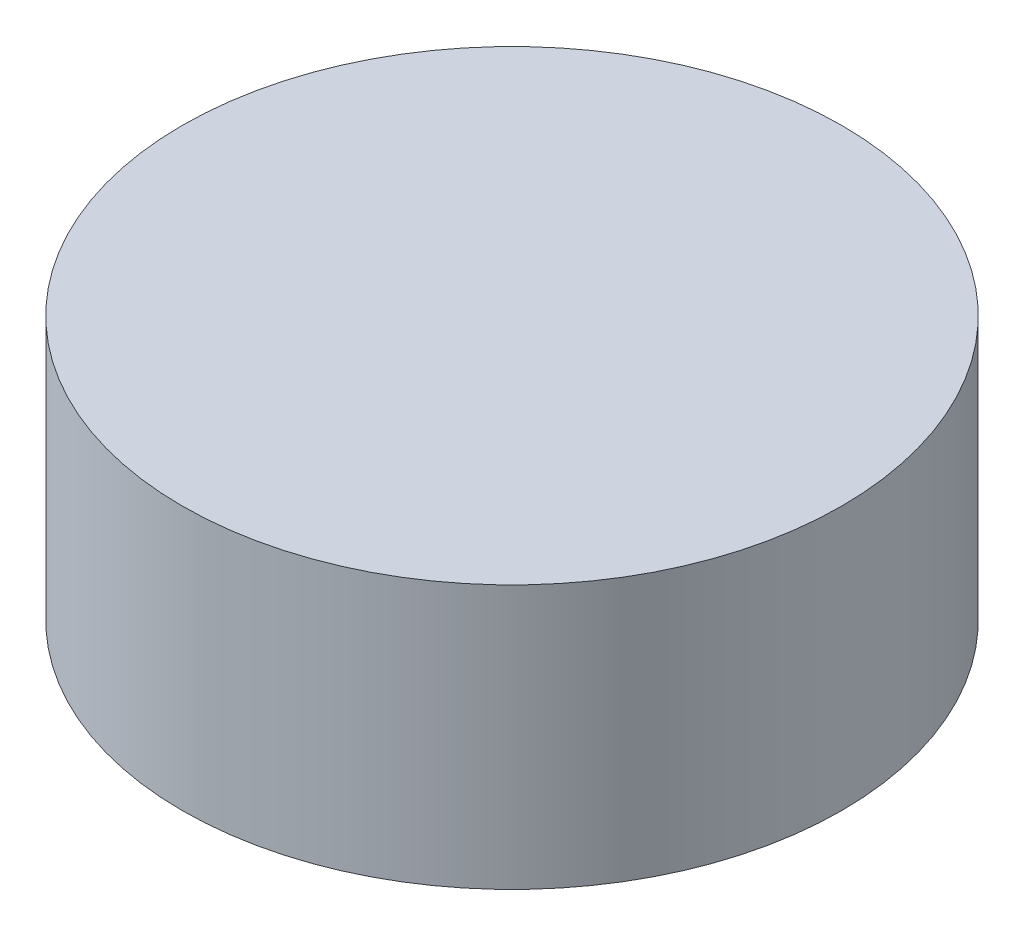
ISO-10303-21;
HEADER;
FILE_DESCRIPTION(('STEP AP214'),'2;1');
FILE_NAME('part.step','',(''),(''),'','','');
FILE_SCHEMA(('AUTOMOTIVE_DESIGN { 1 0 10303 214 1 1 1 1 }'));
ENDSEC;
DATA;
#1=APPLICATION_CONTEXT('core data for automotive mechanical design processes');
#2=APPLICATION_PROTOCOL_DEFINITION('international standard','automotive_design',2000,#1);
#3=PRODUCT_CONTEXT('',#1,'mechanical');
#4=PRODUCT('Part','Part','',(#3));
#5=PRODUCT_RELATED_PRODUCT_CATEGORY('part','',(#4));
#6=PRODUCT_DEFINITION_FORMATION('','',#4);
#7=PRODUCT_DEFINITION_CONTEXT('part definition',#1,'design');
#8=PRODUCT_DEFINITION('design','',#6,#7);
#9=PRODUCT_DEFINITION_SHAPE('','',#8);
#10=(LENGTH_UNIT() NAMED_UNIT(*) SI_UNIT(.MILLI.,.METRE.));
#11=(NAMED_UNIT(*) PLANE_ANGLE_UNIT() SI_UNIT($,.RADIAN.));
#12=(NAMED_UNIT(*) SI_UNIT($,.STERADIAN.) SOLID_ANGLE_UNIT());
#13=UNCERTAINTY_MEASURE_WITH_UNIT(LENGTH_MEASURE(1.E-05),#10,'distance_accuracy_value','');
#14=(GEOMETRIC_REPRESENTATION_CONTEXT(3) GLOBAL_UNCERTAINTY_ASSIGNED_CONTEXT((#13)) GLOBAL_UNIT_ASSIGNED_CONTEXT((#10,
#11,#12)) REPRESENTATION_CONTEXT('',''));
#15=CARTESIAN_POINT('',(0.,0.,0.));
#16=DIRECTION('',(0.,0.,1.));
#17=DIRECTION('',(1.,0.,0.));
#18=AXIS2_PLACEMENT_3D('',#15,#16,#17);
#19=CARTESIAN_POINT('',(0.,32.,0.));
#20=DIRECTION('',(0.,-1.,0.));
#21=DIRECTION('',(0.,0.,-1.));
#22=AXIS2_PLACEMENT_3D('',#19,#20,#21);
#23=CYLINDRICAL_SURFACE('',#22,40.);
#24=CARTESIAN_POINT('',(0.,32.,0.));
#25=DIRECTION('',(0.,1.,0.));
#26=DIRECTION('',(0.,0.,1.));
#27=AXIS2_PLACEMENT_3D('',#24,#25,#26);
#28=CIRCLE('',#27,40.);
#29=CARTESIAN_POINT('',(0.,32.,40.));
#30=VERTEX_POINT('',#29);
#31=EDGE_CURVE('E10',#30,#30,#28,.T.);
#32=ORIENTED_EDGE('',*,*,#31,.F.);
#33=EDGE_LOOP('',(#32));
#34=FACE_BOUND('',#33,.T.);
#35=CARTESIAN_POINT('',(0.,0.,0.));
#36=DIRECTION('',(0.,1.,0.));
#37=DIRECTION('',(0.,0.,1.));
#38=AXIS2_PLACEMENT_3D('',#35,#36,#37);
#39=CIRCLE('',#38,40.);
#40=CARTESIAN_POINT('',(0.,0.,40.));
#41=VERTEX_POINT('',#40);
#42=EDGE_CURVE('E40',#41,#41,#39,.T.);
#43=ORIENTED_EDGE('',*,*,#42,.T.);
#44=EDGE_LOOP('',(#43));
#45=FACE_BOUND('',#44,.T.);
#46=ADVANCED_FACE('F37',(#34,#45),#23,.T.);
#47=CARTESIAN_POINT('',(0.,32.,0.));
#48=DIRECTION('',(0.,1.,0.));
#49=DIRECTION('',(0.,0.,1.));
#50=AXIS2_PLACEMENT_3D('',#47,#48,#49);
#51=PLANE('',#50);
#52=ORIENTED_EDGE('',*,*,#31,.T.);
#53=EDGE_LOOP('',(#52));
#54=FACE_BOUND('',#53,.T.);
#55=ADVANCED_FACE('F54',(#54),#51,.T.);
#56=CARTESIAN_POINT('',(0.,0.,0.));
#57=DIRECTION('',(0.,1.,0.));
#58=DIRECTION('',(0.,0.,1.));
#59=AXIS2_PLACEMENT_3D('',#56,#57,#58);
#60=PLANE('',#59);
#61=ORIENTED_EDGE('',*,*,#42,.F.);
#62=EDGE_LOOP('',(#61));
#63=FACE_BOUND('',#62,.T.);
#64=ADVANCED_FACE('F52',(#63),#60,.F.);
#65=CLOSED_SHELL('',(#46,#55,#64));
#66=MANIFOLD_SOLID_BREP('B2',#65);
#67=ADVANCED_BREP_SHAPE_REPRESENTATION('',(#18,#66),#14);
#68=SHAPE_DEFINITION_REPRESENTATION(#9,#67);
ENDSEC;
END-ISO-10303-21;
